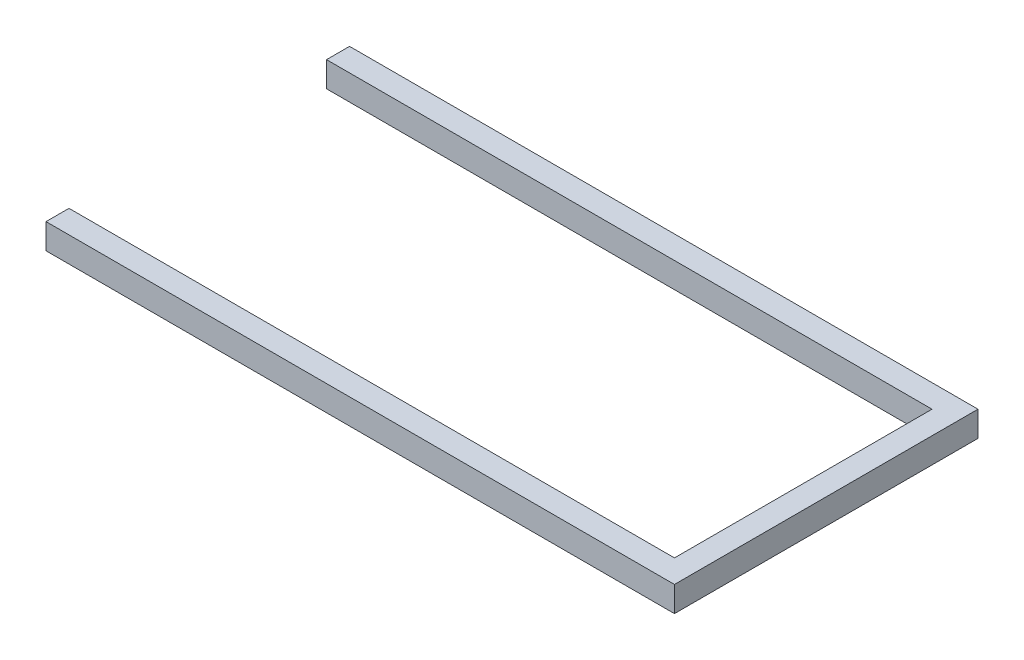
ISO-10303-21;
HEADER;
FILE_DESCRIPTION(('STEP AP214'),'2;1');
FILE_NAME('part.step','',(''),(''),'','','');
FILE_SCHEMA(('AUTOMOTIVE_DESIGN { 1 0 10303 214 1 1 1 1 }'));
ENDSEC;
DATA;
#1=APPLICATION_CONTEXT('core data for automotive mechanical design processes');
#2=APPLICATION_PROTOCOL_DEFINITION('international standard','automotive_design',2000,#1);
#3=PRODUCT_CONTEXT('',#1,'mechanical');
#4=PRODUCT('Part','Part','',(#3));
#5=PRODUCT_RELATED_PRODUCT_CATEGORY('part','',(#4));
#6=PRODUCT_DEFINITION_FORMATION('','',#4);
#7=PRODUCT_DEFINITION_CONTEXT('part definition',#1,'design');
#8=PRODUCT_DEFINITION('design','',#6,#7);
#9=PRODUCT_DEFINITION_SHAPE('','',#8);
#10=(LENGTH_UNIT() NAMED_UNIT(*) SI_UNIT(.MILLI.,.METRE.));
#11=(NAMED_UNIT(*) PLANE_ANGLE_UNIT() SI_UNIT($,.RADIAN.));
#12=(NAMED_UNIT(*) SI_UNIT($,.STERADIAN.) SOLID_ANGLE_UNIT());
#13=UNCERTAINTY_MEASURE_WITH_UNIT(LENGTH_MEASURE(1.E-05),#10,'distance_accuracy_value','');
#14=(GEOMETRIC_REPRESENTATION_CONTEXT(3) GLOBAL_UNCERTAINTY_ASSIGNED_CONTEXT((#13)) GLOBAL_UNIT_ASSIGNED_CONTEXT((#10,
#11,#12)) REPRESENTATION_CONTEXT('',''));
#15=CARTESIAN_POINT('',(0.,0.,0.));
#16=DIRECTION('',(0.,0.,1.));
#17=DIRECTION('',(1.,0.,0.));
#18=AXIS2_PLACEMENT_3D('',#15,#16,#17);
#19=CARTESIAN_POINT('',(-2.5,2.75,2.5));
#20=DIRECTION('',(1.,0.,0.));
#21=DIRECTION('',(0.,0.,-1.));
#22=AXIS2_PLACEMENT_3D('',#19,#20,#21);
#23=PLANE('',#22);
#24=DIRECTION('',(0.,0.,1.));
#25=VECTOR('',#24,1.);
#26=CARTESIAN_POINT('',(-2.5,0.,2.5));
#27=LINE('',#26,#25);
#28=CARTESIAN_POINT('',(-2.5,0.,0.));
#29=VERTEX_POINT('',#28);
#30=CARTESIAN_POINT('',(-2.5,0.,2.5));
#31=VERTEX_POINT('',#30);
#32=EDGE_CURVE('E139',#29,#31,#27,.T.);
#33=ORIENTED_EDGE('',*,*,#32,.T.);
#34=DIRECTION('',(0.,-1.,0.));
#35=VECTOR('',#34,1.);
#36=CARTESIAN_POINT('',(-2.5,2.75,2.5));
#37=LINE('',#36,#35);
#38=CARTESIAN_POINT('',(-2.5,2.75,2.5));
#39=VERTEX_POINT('',#38);
#40=EDGE_CURVE('E47',#39,#31,#37,.T.);
#41=ORIENTED_EDGE('',*,*,#40,.F.);
#42=DIRECTION('',(0.,0.,1.));
#43=VECTOR('',#42,1.);
#44=CARTESIAN_POINT('',(-2.5,2.75,2.5));
#45=LINE('',#44,#43);
#46=CARTESIAN_POINT('',(-2.5,2.75,0.));
#47=VERTEX_POINT('',#46);
#48=EDGE_CURVE('E98',#47,#39,#45,.T.);
#49=ORIENTED_EDGE('',*,*,#48,.F.);
#50=DIRECTION('',(0.,-1.,0.));
#51=VECTOR('',#50,1.);
#52=CARTESIAN_POINT('',(-2.5,2.75,0.));
#53=LINE('',#52,#51);
#54=EDGE_CURVE('E11',#47,#29,#53,.T.);
#55=ORIENTED_EDGE('',*,*,#54,.T.);
#56=EDGE_LOOP('',(#33,#41,#49,#55));
#57=FACE_BOUND('',#56,.T.);
#58=ADVANCED_FACE('F39',(#57),#23,.F.);
#59=CARTESIAN_POINT('',(-2.5,2.75,2.5));
#60=DIRECTION('',(0.,0.,-1.));
#61=DIRECTION('',(-1.,0.,0.));
#62=AXIS2_PLACEMENT_3D('',#59,#60,#61);
#63=PLANE('',#62);
#64=DIRECTION('',(1.,0.,0.));
#65=VECTOR('',#64,1.);
#66=CARTESIAN_POINT('',(-2.5,0.,2.5));
#67=LINE('',#66,#65);
#68=CARTESIAN_POINT('',(65.825,0.,2.5));
#69=VERTEX_POINT('',#68);
#70=EDGE_CURVE('E141',#31,#69,#67,.T.);
#71=ORIENTED_EDGE('',*,*,#70,.T.);
#72=DIRECTION('',(0.,-1.,0.));
#73=VECTOR('',#72,1.);
#74=CARTESIAN_POINT('',(65.825,2.75,2.5));
#75=LINE('',#74,#73);
#76=CARTESIAN_POINT('',(65.825,2.75,2.5));
#77=VERTEX_POINT('',#76);
#78=EDGE_CURVE('E158',#77,#69,#75,.T.);
#79=ORIENTED_EDGE('',*,*,#78,.F.);
#80=DIRECTION('',(1.,0.,0.));
#81=VECTOR('',#80,1.);
#82=CARTESIAN_POINT('',(-2.5,2.75,2.5));
#83=LINE('',#82,#81);
#84=EDGE_CURVE('E166',#39,#77,#83,.T.);
#85=ORIENTED_EDGE('',*,*,#84,.F.);
#86=ORIENTED_EDGE('',*,*,#40,.T.);
#87=EDGE_LOOP('',(#71,#79,#85,#86));
#88=FACE_BOUND('',#87,.T.);
#89=ADVANCED_FACE('F164',(#88),#63,.F.);
#90=CARTESIAN_POINT('',(65.825,2.75,2.5));
#91=DIRECTION('',(-1.,0.,0.));
#92=DIRECTION('',(0.,0.,1.));
#93=AXIS2_PLACEMENT_3D('',#90,#91,#92);
#94=PLANE('',#93);
#95=DIRECTION('',(0.,0.,-1.));
#96=VECTOR('',#95,1.);
#97=CARTESIAN_POINT('',(65.825,0.,2.5));
#98=LINE('',#97,#96);
#99=CARTESIAN_POINT('',(65.825,0.,-30.5));
#100=VERTEX_POINT('',#99);
#101=EDGE_CURVE('E143',#69,#100,#98,.T.);
#102=ORIENTED_EDGE('',*,*,#101,.T.);
#103=DIRECTION('',(0.,-1.,0.));
#104=VECTOR('',#103,1.);
#105=CARTESIAN_POINT('',(65.825,2.75,-30.5));
#106=LINE('',#105,#104);
#107=CARTESIAN_POINT('',(65.825,2.75,-30.5));
#108=VERTEX_POINT('',#107);
#109=EDGE_CURVE('E155',#108,#100,#106,.T.);
#110=ORIENTED_EDGE('',*,*,#109,.F.);
#111=DIRECTION('',(0.,0.,-1.));
#112=VECTOR('',#111,1.);
#113=CARTESIAN_POINT('',(65.825,2.75,2.5));
#114=LINE('',#113,#112);
#115=EDGE_CURVE('E179',#77,#108,#114,.T.);
#116=ORIENTED_EDGE('',*,*,#115,.F.);
#117=ORIENTED_EDGE('',*,*,#78,.T.);
#118=EDGE_LOOP('',(#102,#110,#116,#117));
#119=FACE_BOUND('',#118,.T.);
#120=ADVANCED_FACE('F175',(#119),#94,.F.);
#121=CARTESIAN_POINT('',(-2.5,2.75,-30.5));
#122=DIRECTION('',(0.,0.,1.));
#123=DIRECTION('',(1.,0.,0.));
#124=AXIS2_PLACEMENT_3D('',#121,#122,#123);
#125=PLANE('',#124);
#126=DIRECTION('',(-1.,0.,0.));
#127=VECTOR('',#126,1.);
#128=CARTESIAN_POINT('',(-2.5,0.,-30.5));
#129=LINE('',#128,#127);
#130=CARTESIAN_POINT('',(-2.5,0.,-30.5));
#131=VERTEX_POINT('',#130);
#132=EDGE_CURVE('E145',#100,#131,#129,.T.);
#133=ORIENTED_EDGE('',*,*,#132,.T.);
#134=DIRECTION('',(0.,-1.,0.));
#135=VECTOR('',#134,1.);
#136=CARTESIAN_POINT('',(-2.5,2.75,-30.5));
#137=LINE('',#136,#135);
#138=CARTESIAN_POINT('',(-2.5,2.75,-30.5));
#139=VERTEX_POINT('',#138);
#140=EDGE_CURVE('E128',#139,#131,#137,.T.);
#141=ORIENTED_EDGE('',*,*,#140,.F.);
#142=DIRECTION('',(-1.,0.,0.));
#143=VECTOR('',#142,1.);
#144=CARTESIAN_POINT('',(-2.5,2.75,-30.5));
#145=LINE('',#144,#143);
#146=EDGE_CURVE('E118',#108,#139,#145,.T.);
#147=ORIENTED_EDGE('',*,*,#146,.F.);
#148=ORIENTED_EDGE('',*,*,#109,.T.);
#149=EDGE_LOOP('',(#133,#141,#147,#148));
#150=FACE_BOUND('',#149,.T.);
#151=ADVANCED_FACE('F178',(#150),#125,.F.);
#152=CARTESIAN_POINT('',(-2.5,2.75,-28.));
#153=DIRECTION('',(1.,0.,0.));
#154=DIRECTION('',(0.,0.,-1.));
#155=AXIS2_PLACEMENT_3D('',#152,#153,#154);
#156=PLANE('',#155);
#157=DIRECTION('',(0.,0.,1.));
#158=VECTOR('',#157,1.);
#159=CARTESIAN_POINT('',(-2.5,0.,-28.));
#160=LINE('',#159,#158);
#161=CARTESIAN_POINT('',(-2.5,0.,-28.));
#162=VERTEX_POINT('',#161);
#163=EDGE_CURVE('E127',#131,#162,#160,.T.);
#164=ORIENTED_EDGE('',*,*,#163,.T.);
#165=DIRECTION('',(0.,-1.,0.));
#166=VECTOR('',#165,1.);
#167=CARTESIAN_POINT('',(-2.5,2.75,-28.));
#168=LINE('',#167,#166);
#169=CARTESIAN_POINT('',(-2.5,2.75,-28.));
#170=VERTEX_POINT('',#169);
#171=EDGE_CURVE('E124',#170,#162,#168,.T.);
#172=ORIENTED_EDGE('',*,*,#171,.F.);
#173=DIRECTION('',(0.,0.,1.));
#174=VECTOR('',#173,1.);
#175=CARTESIAN_POINT('',(-2.5,2.75,-28.));
#176=LINE('',#175,#174);
#177=EDGE_CURVE('E112',#139,#170,#176,.T.);
#178=ORIENTED_EDGE('',*,*,#177,.F.);
#179=ORIENTED_EDGE('',*,*,#140,.T.);
#180=EDGE_LOOP('',(#164,#172,#178,#179));
#181=FACE_BOUND('',#180,.T.);
#182=ADVANCED_FACE('F125',(#181),#156,.F.);
#183=CARTESIAN_POINT('',(0.,2.75,-28.));
#184=DIRECTION('',(0.,0.,-1.));
#185=DIRECTION('',(-1.,0.,0.));
#186=AXIS2_PLACEMENT_3D('',#183,#184,#185);
#187=PLANE('',#186);
#188=DIRECTION('',(1.,0.,0.));
#189=VECTOR('',#188,1.);
#190=CARTESIAN_POINT('',(0.,0.,-28.));
#191=LINE('',#190,#189);
#192=CARTESIAN_POINT('',(63.325,0.,-28.));
#193=VERTEX_POINT('',#192);
#194=EDGE_CURVE('E84',#162,#193,#191,.T.);
#195=ORIENTED_EDGE('',*,*,#194,.T.);
#196=DIRECTION('',(0.,-1.,0.));
#197=VECTOR('',#196,1.);
#198=CARTESIAN_POINT('',(63.325,2.75,-28.));
#199=LINE('',#198,#197);
#200=CARTESIAN_POINT('',(63.325,2.75,-28.));
#201=VERTEX_POINT('',#200);
#202=EDGE_CURVE('E129',#201,#193,#199,.T.);
#203=ORIENTED_EDGE('',*,*,#202,.F.);
#204=DIRECTION('',(1.,0.,0.));
#205=VECTOR('',#204,1.);
#206=CARTESIAN_POINT('',(0.,2.75,-28.));
#207=LINE('',#206,#205);
#208=EDGE_CURVE('E116',#170,#201,#207,.T.);
#209=ORIENTED_EDGE('',*,*,#208,.F.);
#210=ORIENTED_EDGE('',*,*,#171,.T.);
#211=EDGE_LOOP('',(#195,#203,#209,#210));
#212=FACE_BOUND('',#211,.T.);
#213=ADVANCED_FACE('F131',(#212),#187,.F.);
#214=CARTESIAN_POINT('',(63.325,2.75,0.));
#215=DIRECTION('',(1.,0.,0.));
#216=DIRECTION('',(0.,0.,-1.));
#217=AXIS2_PLACEMENT_3D('',#214,#215,#216);
#218=PLANE('',#217);
#219=DIRECTION('',(0.,0.,1.));
#220=VECTOR('',#219,1.);
#221=CARTESIAN_POINT('',(63.325,0.,0.));
#222=LINE('',#221,#220);
#223=CARTESIAN_POINT('',(63.325,0.,0.));
#224=VERTEX_POINT('',#223);
#225=EDGE_CURVE('E91',#193,#224,#222,.T.);
#226=ORIENTED_EDGE('',*,*,#225,.T.);
#227=DIRECTION('',(0.,-1.,0.));
#228=VECTOR('',#227,1.);
#229=CARTESIAN_POINT('',(63.325,2.75,0.));
#230=LINE('',#229,#228);
#231=CARTESIAN_POINT('',(63.325,2.75,0.));
#232=VERTEX_POINT('',#231);
#233=EDGE_CURVE('E135',#232,#224,#230,.T.);
#234=ORIENTED_EDGE('',*,*,#233,.F.);
#235=DIRECTION('',(0.,0.,1.));
#236=VECTOR('',#235,1.);
#237=CARTESIAN_POINT('',(63.325,2.75,0.));
#238=LINE('',#237,#236);
#239=EDGE_CURVE('E133',#201,#232,#238,.T.);
#240=ORIENTED_EDGE('',*,*,#239,.F.);
#241=ORIENTED_EDGE('',*,*,#202,.T.);
#242=EDGE_LOOP('',(#226,#234,#240,#241));
#243=FACE_BOUND('',#242,.T.);
#244=ADVANCED_FACE('F200',(#243),#218,.F.);
#245=CARTESIAN_POINT('',(0.,2.75,0.));
#246=DIRECTION('',(0.,0.,1.));
#247=DIRECTION('',(1.,0.,0.));
#248=AXIS2_PLACEMENT_3D('',#245,#246,#247);
#249=PLANE('',#248);
#250=DIRECTION('',(-1.,0.,0.));
#251=VECTOR('',#250,1.);
#252=CARTESIAN_POINT('',(0.,0.,0.));
#253=LINE('',#252,#251);
#254=EDGE_CURVE('E150',#224,#29,#253,.T.);
#255=ORIENTED_EDGE('',*,*,#254,.T.);
#256=ORIENTED_EDGE('',*,*,#54,.F.);
#257=DIRECTION('',(-1.,0.,0.));
#258=VECTOR('',#257,1.);
#259=CARTESIAN_POINT('',(0.,2.75,0.));
#260=LINE('',#259,#258);
#261=EDGE_CURVE('E55',#232,#47,#260,.T.);
#262=ORIENTED_EDGE('',*,*,#261,.F.);
#263=ORIENTED_EDGE('',*,*,#233,.T.);
#264=EDGE_LOOP('',(#255,#256,#262,#263));
#265=FACE_BOUND('',#264,.T.);
#266=ADVANCED_FACE('F184',(#265),#249,.F.);
#267=CARTESIAN_POINT('',(0.,2.75,0.));
#268=DIRECTION('',(0.,-1.,0.));
#269=DIRECTION('',(0.,0.,-1.));
#270=AXIS2_PLACEMENT_3D('',#267,#268,#269);
#271=PLANE('',#270);
#272=ORIENTED_EDGE('',*,*,#261,.T.);
#273=ORIENTED_EDGE('',*,*,#48,.T.);
#274=ORIENTED_EDGE('',*,*,#84,.T.);
#275=ORIENTED_EDGE('',*,*,#115,.T.);
#276=ORIENTED_EDGE('',*,*,#146,.T.);
#277=ORIENTED_EDGE('',*,*,#177,.T.);
#278=ORIENTED_EDGE('',*,*,#208,.T.);
#279=ORIENTED_EDGE('',*,*,#239,.T.);
#280=EDGE_LOOP('',(#272,#273,#274,#275,#276,#277,#278,#279));
#281=FACE_BOUND('',#280,.T.);
#282=ADVANCED_FACE('F114',(#281),#271,.F.);
#283=CARTESIAN_POINT('',(0.,0.,0.));
#284=DIRECTION('',(0.,-1.,0.));
#285=DIRECTION('',(0.,0.,-1.));
#286=AXIS2_PLACEMENT_3D('',#283,#284,#285);
#287=PLANE('',#286);
#288=ORIENTED_EDGE('',*,*,#32,.F.);
#289=ORIENTED_EDGE('',*,*,#254,.F.);
#290=ORIENTED_EDGE('',*,*,#225,.F.);
#291=ORIENTED_EDGE('',*,*,#194,.F.);
#292=ORIENTED_EDGE('',*,*,#163,.F.);
#293=ORIENTED_EDGE('',*,*,#132,.F.);
#294=ORIENTED_EDGE('',*,*,#101,.F.);
#295=ORIENTED_EDGE('',*,*,#70,.F.);
#296=EDGE_LOOP('',(#288,#289,#290,#291,#292,#293,#294,#295));
#297=FACE_BOUND('',#296,.T.);
#298=ADVANCED_FACE('F170',(#297),#287,.T.);
#299=CLOSED_SHELL('',(#58,#89,#120,#151,#182,#213,#244,#266,#282,#298));
#300=MANIFOLD_SOLID_BREP('B2',#299);
#301=ADVANCED_BREP_SHAPE_REPRESENTATION('',(#18,#300),#14);
#302=SHAPE_DEFINITION_REPRESENTATION(#9,#301);
ENDSEC;
END-ISO-10303-21;
